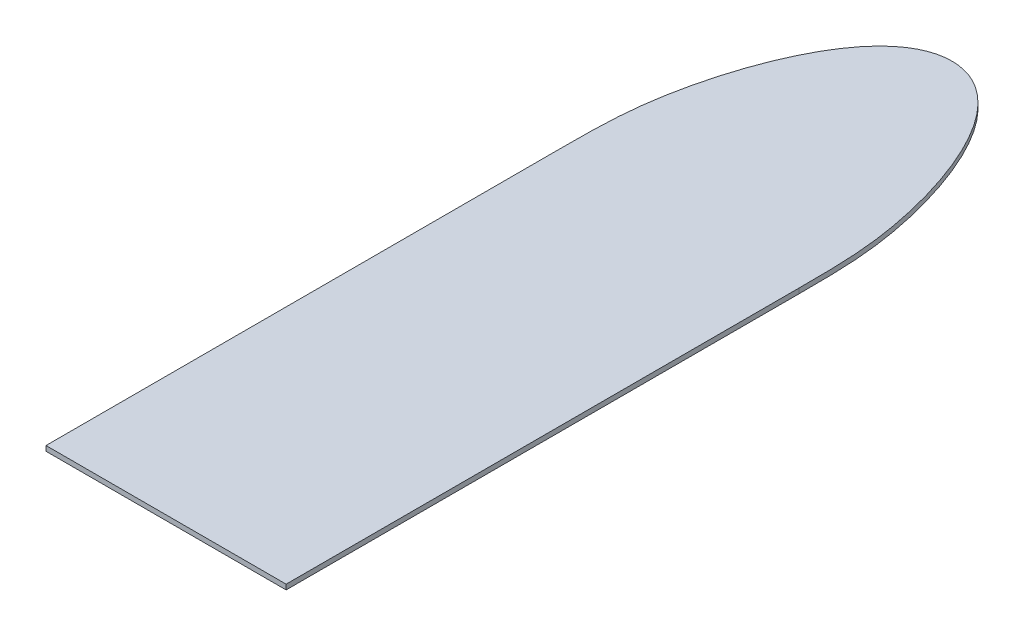
ISO-10303-21;
HEADER;
FILE_DESCRIPTION(('STEP AP214'),'2;1');
FILE_NAME('part.step','',(''),(''),'','','');
FILE_SCHEMA(('AUTOMOTIVE_DESIGN { 1 0 10303 214 1 1 1 1 }'));
ENDSEC;
DATA;
#1=APPLICATION_CONTEXT('core data for automotive mechanical design processes');
#2=APPLICATION_PROTOCOL_DEFINITION('international standard','automotive_design',2000,#1);
#3=PRODUCT_CONTEXT('',#1,'mechanical');
#4=PRODUCT('Part','Part','',(#3));
#5=PRODUCT_RELATED_PRODUCT_CATEGORY('part','',(#4));
#6=PRODUCT_DEFINITION_FORMATION('','',#4);
#7=PRODUCT_DEFINITION_CONTEXT('part definition',#1,'design');
#8=PRODUCT_DEFINITION('design','',#6,#7);
#9=PRODUCT_DEFINITION_SHAPE('','',#8);
#10=(LENGTH_UNIT() NAMED_UNIT(*) SI_UNIT(.MILLI.,.METRE.));
#11=(NAMED_UNIT(*) PLANE_ANGLE_UNIT() SI_UNIT($,.RADIAN.));
#12=(NAMED_UNIT(*) SI_UNIT($,.STERADIAN.) SOLID_ANGLE_UNIT());
#13=UNCERTAINTY_MEASURE_WITH_UNIT(LENGTH_MEASURE(1.E-05),#10,'distance_accuracy_value','');
#14=(GEOMETRIC_REPRESENTATION_CONTEXT(3) GLOBAL_UNCERTAINTY_ASSIGNED_CONTEXT((#13)) GLOBAL_UNIT_ASSIGNED_CONTEXT((#10,
#11,#12)) REPRESENTATION_CONTEXT('',''));
#15=CARTESIAN_POINT('',(0.,0.,0.));
#16=DIRECTION('',(0.,0.,1.));
#17=DIRECTION('',(1.,0.,0.));
#18=AXIS2_PLACEMENT_3D('',#15,#16,#17);
#19=CARTESIAN_POINT('',(139.7,5.842,1270.));
#20=DIRECTION('',(-1.,0.,0.));
#21=DIRECTION('',(0.,0.,1.));
#22=AXIS2_PLACEMENT_3D('',#19,#20,#21);
#23=PLANE('',#22);
#24=DIRECTION('',(0.,-1.,0.));
#25=VECTOR('',#24,1.);
#26=CARTESIAN_POINT('',(139.7,5.842,533.4));
#27=LINE('',#26,#25);
#28=CARTESIAN_POINT('',(139.7,5.842,533.4));
#29=VERTEX_POINT('',#28);
#30=CARTESIAN_POINT('',(139.7,0.,533.4));
#31=VERTEX_POINT('',#30);
#32=EDGE_CURVE('E83',#29,#31,#27,.T.);
#33=ORIENTED_EDGE('',*,*,#32,.T.);
#34=DIRECTION('',(0.,0.,-1.));
#35=VECTOR('',#34,1.);
#36=CARTESIAN_POINT('',(139.7,0.,1270.));
#37=LINE('',#36,#35);
#38=CARTESIAN_POINT('',(139.7,0.,-63.4999999999999));
#39=VERTEX_POINT('',#38);
#40=EDGE_CURVE('E127',#31,#39,#37,.T.);
#41=ORIENTED_EDGE('',*,*,#40,.T.);
#42=DIRECTION('',(0.,-1.,0.));
#43=VECTOR('',#42,1.);
#44=CARTESIAN_POINT('',(139.7,5.842,-63.4999999999999));
#45=LINE('',#44,#43);
#46=CARTESIAN_POINT('',(139.7,5.842,-63.4999999999999));
#47=VERTEX_POINT('',#46);
#48=EDGE_CURVE('E11',#47,#39,#45,.T.);
#49=ORIENTED_EDGE('',*,*,#48,.F.);
#50=DIRECTION('',(0.,0.,-1.));
#51=VECTOR('',#50,1.);
#52=CARTESIAN_POINT('',(139.7,5.842,1270.));
#53=LINE('',#52,#51);
#54=EDGE_CURVE('E43',#29,#47,#53,.T.);
#55=ORIENTED_EDGE('',*,*,#54,.F.);
#56=EDGE_LOOP('',(#33,#41,#49,#55));
#57=FACE_BOUND('',#56,.T.);
#58=ADVANCED_FACE('F33',(#57),#23,.F.);
#59=CARTESIAN_POINT('',(114.697356932435,5.842,-249.113052580453));
#60=DIRECTION('',(0.,-1.,0.));
#61=DIRECTION('',(0.,0.,-1.));
#62=AXIS2_PLACEMENT_3D('',#59,#60,#61);
#63=PLANE('',#62);
#64=DIRECTION('',(-1.,0.,0.));
#65=VECTOR('',#64,1.);
#66=CARTESIAN_POINT('',(1.11981703314034E-13,5.842,533.4));
#67=LINE('',#66,#65);
#68=CARTESIAN_POINT('',(-139.7,5.842,533.4));
#69=VERTEX_POINT('',#68);
#70=EDGE_CURVE('E77',#29,#69,#67,.T.);
#71=ORIENTED_EDGE('',*,*,#70,.F.);
#72=ORIENTED_EDGE('',*,*,#54,.T.);
#73=CARTESIAN_POINT('',(139.7,5.842,-63.4999999999999));
#74=CARTESIAN_POINT('',(139.7,5.842,-105.409860509047));
#75=CARTESIAN_POINT('',(138.775867716245,5.842,-206.495657368136));
#76=CARTESIAN_POINT('',(73.5078495153538,5.842,-381.));
#77=CARTESIAN_POINT('',(0.,5.842,-381.));
#78=B_SPLINE_CURVE_WITH_KNOTS('',3,(#73,#74,#75,#76,#77),.UNSPECIFIED.,.F.,.F.,(4,1,4),
(0.803817555321419,0.866735408320802,1.),.UNSPECIFIED.);
#79=CARTESIAN_POINT('',(0.,5.842,-381.));
#80=VERTEX_POINT('',#79);
#81=EDGE_CURVE('E132',#47,#80,#78,.T.);
#82=ORIENTED_EDGE('',*,*,#81,.T.);
#83=CARTESIAN_POINT('',(-139.7,5.842,-63.4999999999999));
#84=CARTESIAN_POINT('',(-139.7,5.842,-105.409860509047));
#85=CARTESIAN_POINT('',(-138.775867716245,5.842,-206.495657368136));
#86=CARTESIAN_POINT('',(-73.5078495153538,5.842,-381.));
#87=CARTESIAN_POINT('',(0.,5.842,-381.));
#88=B_SPLINE_CURVE_WITH_KNOTS('',3,(#83,#84,#85,#86,#87),.UNSPECIFIED.,.F.,.F.,(4,1,4),
(0.803817555321419,0.866735408320802,1.),.UNSPECIFIED.);
#89=CARTESIAN_POINT('',(-139.7,5.842,-63.4999999999999));
#90=VERTEX_POINT('',#89);
#91=EDGE_CURVE('E89',#90,#80,#88,.T.);
#92=ORIENTED_EDGE('',*,*,#91,.F.);
#93=DIRECTION('',(0.,0.,-1.));
#94=VECTOR('',#93,1.);
#95=CARTESIAN_POINT('',(-139.7,5.842,1270.));
#96=LINE('',#95,#94);
#97=EDGE_CURVE('E87',#69,#90,#96,.T.);
#98=ORIENTED_EDGE('',*,*,#97,.F.);
#99=EDGE_LOOP('',(#71,#72,#82,#92,#98));
#100=FACE_BOUND('',#99,.T.);
#101=ADVANCED_FACE('F88',(#100),#63,.F.);
#102=CARTESIAN_POINT('',(114.697356932435,0.,-249.113052580453));
#103=DIRECTION('',(0.,-1.,0.));
#104=DIRECTION('',(0.,0.,-1.));
#105=AXIS2_PLACEMENT_3D('',#102,#103,#104);
#106=PLANE('',#105);
#107=ORIENTED_EDGE('',*,*,#40,.F.);
#108=DIRECTION('',(-1.,0.,0.));
#109=VECTOR('',#108,1.);
#110=CARTESIAN_POINT('',(1.11981703314034E-13,0.,533.4));
#111=LINE('',#110,#109);
#112=CARTESIAN_POINT('',(-139.7,0.,533.4));
#113=VERTEX_POINT('',#112);
#114=EDGE_CURVE('E84',#31,#113,#111,.T.);
#115=ORIENTED_EDGE('',*,*,#114,.T.);
#116=DIRECTION('',(0.,0.,-1.));
#117=VECTOR('',#116,1.);
#118=CARTESIAN_POINT('',(-139.7,0.,1270.));
#119=LINE('',#118,#117);
#120=CARTESIAN_POINT('',(-139.7,0.,-63.4999999999999));
#121=VERTEX_POINT('',#120);
#122=EDGE_CURVE('E98',#113,#121,#119,.T.);
#123=ORIENTED_EDGE('',*,*,#122,.T.);
#124=CARTESIAN_POINT('',(-139.7,0.,-63.4999999999999));
#125=CARTESIAN_POINT('',(-139.7,0.,-105.409860509047));
#126=CARTESIAN_POINT('',(-138.775867716245,0.,-206.495657368136));
#127=CARTESIAN_POINT('',(-73.5078495153538,0.,-381.));
#128=CARTESIAN_POINT('',(0.,0.,-381.));
#129=B_SPLINE_CURVE_WITH_KNOTS('',3,(#124,#125,#126,#127,#128),.UNSPECIFIED.,.F.,.F.,(4,1,4),
(0.803817555321419,0.866735408320802,1.),.UNSPECIFIED.);
#130=CARTESIAN_POINT('',(0.,0.,-381.));
#131=VERTEX_POINT('',#130);
#132=EDGE_CURVE('E99',#121,#131,#129,.T.);
#133=ORIENTED_EDGE('',*,*,#132,.T.);
#134=CARTESIAN_POINT('',(139.7,0.,-63.4999999999999));
#135=CARTESIAN_POINT('',(139.7,0.,-105.409860509047));
#136=CARTESIAN_POINT('',(138.775867716245,0.,-206.495657368136));
#137=CARTESIAN_POINT('',(73.5078495153538,0.,-381.));
#138=CARTESIAN_POINT('',(0.,0.,-381.));
#139=B_SPLINE_CURVE_WITH_KNOTS('',3,(#134,#135,#136,#137,#138),.UNSPECIFIED.,.F.,.F.,(4,1,4),
(0.803817555321419,0.866735408320802,1.),.UNSPECIFIED.);
#140=EDGE_CURVE('E128',#39,#131,#139,.T.);
#141=ORIENTED_EDGE('',*,*,#140,.F.);
#142=EDGE_LOOP('',(#107,#115,#123,#133,#141));
#143=FACE_BOUND('',#142,.T.);
#144=ADVANCED_FACE('F119',(#143),#106,.T.);
#145=DIRECTION('',(0.,-1.,0.));
#146=VECTOR('',#145,1.);
#147=SURFACE_OF_LINEAR_EXTRUSION('',#78,#146);
#148=ORIENTED_EDGE('',*,*,#140,.T.);
#149=DIRECTION('',(0.,-1.,0.));
#150=VECTOR('',#149,1.);
#151=CARTESIAN_POINT('',(0.,5.842,-381.));
#152=LINE('',#151,#150);
#153=EDGE_CURVE('E147',#80,#131,#152,.T.);
#154=ORIENTED_EDGE('',*,*,#153,.F.);
#155=ORIENTED_EDGE('',*,*,#81,.F.);
#156=ORIENTED_EDGE('',*,*,#48,.T.);
#157=EDGE_LOOP('',(#148,#154,#155,#156));
#158=FACE_BOUND('',#157,.T.);
#159=ADVANCED_FACE('F35',(#158),#147,.F.);
#160=CARTESIAN_POINT('',(1.11981703314034E-13,5.842,533.4));
#161=DIRECTION('',(0.,0.,1.));
#162=DIRECTION('',(1.,0.,0.));
#163=AXIS2_PLACEMENT_3D('',#160,#161,#162);
#164=PLANE('',#163);
#165=ORIENTED_EDGE('',*,*,#114,.F.);
#166=ORIENTED_EDGE('',*,*,#32,.F.);
#167=ORIENTED_EDGE('',*,*,#70,.T.);
#168=DIRECTION('',(0.,-1.,0.));
#169=VECTOR('',#168,1.);
#170=CARTESIAN_POINT('',(-139.7,5.842,533.4));
#171=LINE('',#170,#169);
#172=EDGE_CURVE('E81',#69,#113,#171,.T.);
#173=ORIENTED_EDGE('',*,*,#172,.T.);
#174=EDGE_LOOP('',(#165,#166,#167,#173));
#175=FACE_BOUND('',#174,.T.);
#176=ADVANCED_FACE('F79',(#175),#164,.T.);
#177=CARTESIAN_POINT('',(-139.7,5.842,1270.));
#178=DIRECTION('',(1.,0.,0.));
#179=DIRECTION('',(0.,0.,1.));
#180=AXIS2_PLACEMENT_3D('',#177,#178,#179);
#181=PLANE('',#180);
#182=ORIENTED_EDGE('',*,*,#172,.F.);
#183=ORIENTED_EDGE('',*,*,#97,.T.);
#184=DIRECTION('',(0.,-1.,0.));
#185=VECTOR('',#184,1.);
#186=CARTESIAN_POINT('',(-139.7,5.842,-63.4999999999999));
#187=LINE('',#186,#185);
#188=EDGE_CURVE('E93',#90,#121,#187,.T.);
#189=ORIENTED_EDGE('',*,*,#188,.T.);
#190=ORIENTED_EDGE('',*,*,#122,.F.);
#191=EDGE_LOOP('',(#182,#183,#189,#190));
#192=FACE_BOUND('',#191,.T.);
#193=ADVANCED_FACE('F96',(#192),#181,.F.);
#194=DIRECTION('',(0.,-1.,0.));
#195=VECTOR('',#194,1.);
#196=SURFACE_OF_LINEAR_EXTRUSION('',#88,#195);
#197=ORIENTED_EDGE('',*,*,#132,.F.);
#198=ORIENTED_EDGE('',*,*,#188,.F.);
#199=ORIENTED_EDGE('',*,*,#91,.T.);
#200=ORIENTED_EDGE('',*,*,#153,.T.);
#201=EDGE_LOOP('',(#197,#198,#199,#200));
#202=FACE_BOUND('',#201,.T.);
#203=ADVANCED_FACE('F110',(#202),#196,.T.);
#204=CLOSED_SHELL('',(#58,#101,#144,#159,#176,#193,#203));
#205=MANIFOLD_SOLID_BREP('B2',#204);
#206=ADVANCED_BREP_SHAPE_REPRESENTATION('',(#18,#205),#14);
#207=SHAPE_DEFINITION_REPRESENTATION(#9,#206);
ENDSEC;
END-ISO-10303-21;
